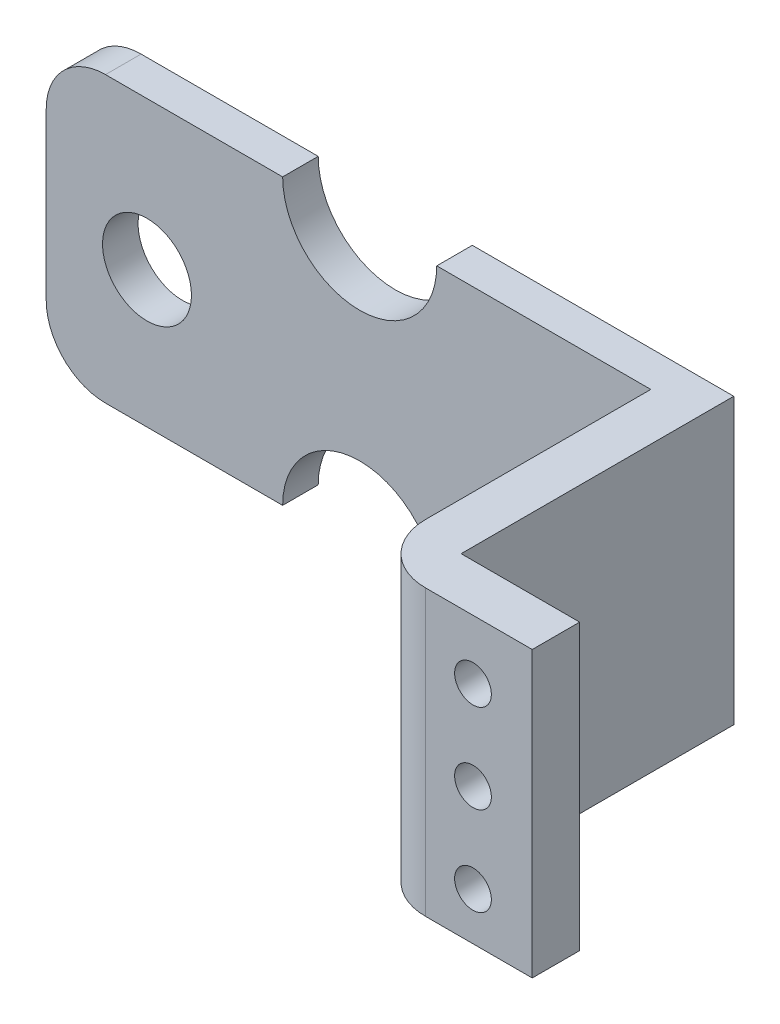
ISO-10303-21;
HEADER;
FILE_DESCRIPTION(('STEP AP214'),'2;1');
FILE_NAME('part.step','',(''),(''),'','','');
FILE_SCHEMA(('AUTOMOTIVE_DESIGN { 1 0 10303 214 1 1 1 1 }'));
ENDSEC;
DATA;
#1=APPLICATION_CONTEXT('core data for automotive mechanical design processes');
#2=APPLICATION_PROTOCOL_DEFINITION('international standard','automotive_design',2000,#1);
#3=PRODUCT_CONTEXT('',#1,'mechanical');
#4=PRODUCT('Part','Part','',(#3));
#5=PRODUCT_RELATED_PRODUCT_CATEGORY('part','',(#4));
#6=PRODUCT_DEFINITION_FORMATION('','',#4);
#7=PRODUCT_DEFINITION_CONTEXT('part definition',#1,'design');
#8=PRODUCT_DEFINITION('design','',#6,#7);
#9=PRODUCT_DEFINITION_SHAPE('','',#8);
#10=(LENGTH_UNIT() NAMED_UNIT(*) SI_UNIT(.MILLI.,.METRE.));
#11=(NAMED_UNIT(*) PLANE_ANGLE_UNIT() SI_UNIT($,.RADIAN.));
#12=(NAMED_UNIT(*) SI_UNIT($,.STERADIAN.) SOLID_ANGLE_UNIT());
#13=UNCERTAINTY_MEASURE_WITH_UNIT(LENGTH_MEASURE(1.E-05),#10,'distance_accuracy_value','');
#14=(GEOMETRIC_REPRESENTATION_CONTEXT(3) GLOBAL_UNCERTAINTY_ASSIGNED_CONTEXT((#13)) GLOBAL_UNIT_ASSIGNED_CONTEXT((#10,
#11,#12)) REPRESENTATION_CONTEXT('',''));
#15=CARTESIAN_POINT('',(0.,0.,0.));
#16=DIRECTION('',(0.,0.,1.));
#17=DIRECTION('',(1.,0.,0.));
#18=AXIS2_PLACEMENT_3D('',#15,#16,#17);
#19=CARTESIAN_POINT('',(27.5,-12.,3.));
#20=DIRECTION('',(0.,1.,0.));
#21=DIRECTION('',(-1.,0.,0.));
#22=AXIS2_PLACEMENT_3D('',#19,#20,#21);
#23=PLANE('',#22);
#24=DIRECTION('',(1.,0.,0.));
#25=VECTOR('',#24,1.);
#26=CARTESIAN_POINT('',(27.5,-12.,3.));
#27=LINE('',#26,#25);
#28=CARTESIAN_POINT('',(-22.5,-12.,3.));
#29=VERTEX_POINT('',#28);
#30=CARTESIAN_POINT('',(-7.55662202552214,-12.,3.));
#31=VERTEX_POINT('',#30);
#32=EDGE_CURVE('E173',#29,#31,#27,.T.);
#33=ORIENTED_EDGE('',*,*,#32,.F.);
#34=DIRECTION('',(0.,0.,-1.));
#35=VECTOR('',#34,1.);
#36=CARTESIAN_POINT('',(-22.5,-12.,3.));
#37=LINE('',#36,#35);
#38=CARTESIAN_POINT('',(-22.5,-12.,0.));
#39=VERTEX_POINT('',#38);
#40=EDGE_CURVE('E211',#29,#39,#37,.T.);
#41=ORIENTED_EDGE('',*,*,#40,.T.);
#42=DIRECTION('',(1.,0.,0.));
#43=VECTOR('',#42,1.);
#44=CARTESIAN_POINT('',(27.5,-12.,0.));
#45=LINE('',#44,#43);
#46=CARTESIAN_POINT('',(-7.55662202552214,-12.,0.));
#47=VERTEX_POINT('',#46);
#48=EDGE_CURVE('E181',#39,#47,#45,.T.);
#49=ORIENTED_EDGE('',*,*,#48,.T.);
#50=DIRECTION('',(0.,0.,1.));
#51=VECTOR('',#50,1.);
#52=CARTESIAN_POINT('',(-7.55662202552214,-12.,-0.00100000000000013));
#53=LINE('',#52,#51);
#54=EDGE_CURVE('E233',#31,#47,#53,.F.);
#55=ORIENTED_EDGE('',*,*,#54,.F.);
#56=EDGE_LOOP('',(#33,#41,#49,#55));
#57=FACE_BOUND('',#56,.T.);
#58=ADVANCED_FACE('F34',(#57),#23,.F.);
#59=CARTESIAN_POINT('',(27.5,12.,3.));
#60=DIRECTION('',(0.,-1.,0.));
#61=DIRECTION('',(1.,0.,0.));
#62=AXIS2_PLACEMENT_3D('',#59,#60,#61);
#63=PLANE('',#62);
#64=DIRECTION('',(0.,0.,-1.));
#65=VECTOR('',#64,1.);
#66=CARTESIAN_POINT('',(23.5,12.,27.));
#67=LINE('',#66,#65);
#68=CARTESIAN_POINT('',(23.5,12.,22.));
#69=VERTEX_POINT('',#68);
#70=CARTESIAN_POINT('',(23.5,12.,3.));
#71=VERTEX_POINT('',#70);
#72=EDGE_CURVE('E291',#69,#71,#67,.T.);
#73=ORIENTED_EDGE('',*,*,#72,.F.);
#74=CARTESIAN_POINT('',(28.5,12.,22.));
#75=DIRECTION('',(0.,-1.,0.));
#76=DIRECTION('',(1.,0.,0.));
#77=AXIS2_PLACEMENT_3D('',#74,#75,#76);
#78=CIRCLE('',#77,5.);
#79=CARTESIAN_POINT('',(28.5,12.,27.));
#80=VERTEX_POINT('',#79);
#81=EDGE_CURVE('E209',#69,#80,#78,.F.);
#82=ORIENTED_EDGE('',*,*,#81,.T.);
#83=DIRECTION('',(-1.,0.,0.));
#84=VECTOR('',#83,1.);
#85=CARTESIAN_POINT('',(27.5,12.,27.));
#86=LINE('',#85,#84);
#87=CARTESIAN_POINT('',(37.5,12.,27.));
#88=VERTEX_POINT('',#87);
#89=EDGE_CURVE('E283',#88,#80,#86,.T.);
#90=ORIENTED_EDGE('',*,*,#89,.F.);
#91=DIRECTION('',(0.,0.,1.));
#92=VECTOR('',#91,1.);
#93=CARTESIAN_POINT('',(37.5,12.,27.));
#94=LINE('',#93,#92);
#95=CARTESIAN_POINT('',(37.5,12.,23.));
#96=VERTEX_POINT('',#95);
#97=EDGE_CURVE('E272',#96,#88,#94,.T.);
#98=ORIENTED_EDGE('',*,*,#97,.F.);
#99=DIRECTION('',(-1.,0.,0.));
#100=VECTOR('',#99,1.);
#101=CARTESIAN_POINT('',(37.5,12.,23.));
#102=LINE('',#101,#100);
#103=CARTESIAN_POINT('',(27.5,12.,23.));
#104=VERTEX_POINT('',#103);
#105=EDGE_CURVE('E275',#96,#104,#102,.T.);
#106=ORIENTED_EDGE('',*,*,#105,.T.);
#107=DIRECTION('',(0.,0.,-1.));
#108=VECTOR('',#107,1.);
#109=CARTESIAN_POINT('',(27.5,12.,3.));
#110=LINE('',#109,#108);
#111=CARTESIAN_POINT('',(27.5,12.,0.));
#112=VERTEX_POINT('',#111);
#113=EDGE_CURVE('E168',#104,#112,#110,.T.);
#114=ORIENTED_EDGE('',*,*,#113,.T.);
#115=DIRECTION('',(-1.,0.,0.));
#116=VECTOR('',#115,1.);
#117=CARTESIAN_POINT('',(27.5,12.,0.));
#118=LINE('',#117,#116);
#119=CARTESIAN_POINT('',(5.44337797447786,12.,0.));
#120=VERTEX_POINT('',#119);
#121=EDGE_CURVE('E160',#112,#120,#118,.T.);
#122=ORIENTED_EDGE('',*,*,#121,.T.);
#123=DIRECTION('',(0.,0.,1.));
#124=VECTOR('',#123,1.);
#125=CARTESIAN_POINT('',(5.44337797447786,12.,-0.00100000000000013));
#126=LINE('',#125,#124);
#127=CARTESIAN_POINT('',(5.44337797447786,12.,3.));
#128=VERTEX_POINT('',#127);
#129=EDGE_CURVE('E145',#128,#120,#126,.F.);
#130=ORIENTED_EDGE('',*,*,#129,.F.);
#131=DIRECTION('',(-1.,0.,0.));
#132=VECTOR('',#131,1.);
#133=CARTESIAN_POINT('',(27.5,12.,3.));
#134=LINE('',#133,#132);
#135=EDGE_CURVE('E158',#71,#128,#134,.T.);
#136=ORIENTED_EDGE('',*,*,#135,.F.);
#137=EDGE_LOOP('',(#73,#82,#90,#98,#106,#114,#122,#130,#136));
#138=FACE_BOUND('',#137,.T.);
#139=ADVANCED_FACE('F157',(#138),#63,.F.);
#140=CARTESIAN_POINT('',(27.5,-12.,3.));
#141=DIRECTION('',(-1.,0.,0.));
#142=DIRECTION('',(0.,0.,1.));
#143=AXIS2_PLACEMENT_3D('',#140,#141,#142);
#144=PLANE('',#143);
#145=DIRECTION('',(0.,1.,0.));
#146=VECTOR('',#145,1.);
#147=CARTESIAN_POINT('',(27.5,12.,23.));
#148=LINE('',#147,#146);
#149=CARTESIAN_POINT('',(27.5,-12.,23.));
#150=VERTEX_POINT('',#149);
#151=EDGE_CURVE('E202',#150,#104,#148,.T.);
#152=ORIENTED_EDGE('',*,*,#151,.F.);
#153=DIRECTION('',(0.,0.,-1.));
#154=VECTOR('',#153,1.);
#155=CARTESIAN_POINT('',(27.5,-12.,3.));
#156=LINE('',#155,#154);
#157=CARTESIAN_POINT('',(27.5,-12.,0.));
#158=VERTEX_POINT('',#157);
#159=EDGE_CURVE('E171',#150,#158,#156,.T.);
#160=ORIENTED_EDGE('',*,*,#159,.T.);
#161=DIRECTION('',(0.,1.,0.));
#162=VECTOR('',#161,1.);
#163=CARTESIAN_POINT('',(27.5,-12.,0.));
#164=LINE('',#163,#162);
#165=EDGE_CURVE('E183',#158,#112,#164,.T.);
#166=ORIENTED_EDGE('',*,*,#165,.T.);
#167=ORIENTED_EDGE('',*,*,#113,.F.);
#168=EDGE_LOOP('',(#152,#160,#166,#167));
#169=FACE_BOUND('',#168,.T.);
#170=ADVANCED_FACE('F330',(#169),#144,.F.);
#171=CARTESIAN_POINT('',(0.,0.,3.));
#172=DIRECTION('',(0.,0.,1.));
#173=DIRECTION('',(1.,0.,0.));
#174=AXIS2_PLACEMENT_3D('',#171,#172,#173);
#175=PLANE('',#174);
#176=DIRECTION('',(0.,-1.,0.));
#177=VECTOR('',#176,1.);
#178=CARTESIAN_POINT('',(-27.5,-12.,3.));
#179=LINE('',#178,#177);
#180=CARTESIAN_POINT('',(-27.5,7.,3.));
#181=VERTEX_POINT('',#180);
#182=CARTESIAN_POINT('',(-27.5,-7.,3.));
#183=VERTEX_POINT('',#182);
#184=EDGE_CURVE('E187',#181,#183,#179,.T.);
#185=ORIENTED_EDGE('',*,*,#184,.T.);
#186=CARTESIAN_POINT('',(-22.5,-7.,3.));
#187=DIRECTION('',(0.,0.,1.));
#188=DIRECTION('',(1.,0.,0.));
#189=AXIS2_PLACEMENT_3D('',#186,#187,#188);
#190=CIRCLE('',#189,5.);
#191=EDGE_CURVE('E42',#183,#29,#190,.T.);
#192=ORIENTED_EDGE('',*,*,#191,.T.);
#193=ORIENTED_EDGE('',*,*,#32,.T.);
#194=CARTESIAN_POINT('',(-1.05662202552214,-12.,3.));
#195=DIRECTION('',(0.,0.,1.));
#196=DIRECTION('',(-1.,0.,0.));
#197=AXIS2_PLACEMENT_3D('',#194,#195,#196);
#198=CIRCLE('',#197,6.5);
#199=CARTESIAN_POINT('',(5.44337797447786,-12.,3.));
#200=VERTEX_POINT('',#199);
#201=EDGE_CURVE('E249',#200,#31,#198,.T.);
#202=ORIENTED_EDGE('',*,*,#201,.F.);
#203=CARTESIAN_POINT('',(23.5,-12.,3.));
#204=VERTEX_POINT('',#203);
#205=EDGE_CURVE('E234',#200,#204,#27,.T.);
#206=ORIENTED_EDGE('',*,*,#205,.T.);
#207=DIRECTION('',(0.,-1.,0.));
#208=VECTOR('',#207,1.);
#209=CARTESIAN_POINT('',(23.5,12.,3.));
#210=LINE('',#209,#208);
#211=EDGE_CURVE('E167',#71,#204,#210,.T.);
#212=ORIENTED_EDGE('',*,*,#211,.F.);
#213=ORIENTED_EDGE('',*,*,#135,.T.);
#214=CARTESIAN_POINT('',(-1.05662202552214,12.,3.));
#215=DIRECTION('',(0.,0.,1.));
#216=DIRECTION('',(1.,0.,0.));
#217=AXIS2_PLACEMENT_3D('',#214,#215,#216);
#218=CIRCLE('',#217,6.5);
#219=CARTESIAN_POINT('',(-7.55662202552214,12.,3.));
#220=VERTEX_POINT('',#219);
#221=EDGE_CURVE('E142',#220,#128,#218,.T.);
#222=ORIENTED_EDGE('',*,*,#221,.F.);
#223=CARTESIAN_POINT('',(-22.5,12.,3.));
#224=VERTEX_POINT('',#223);
#225=EDGE_CURVE('E169',#220,#224,#134,.T.);
#226=ORIENTED_EDGE('',*,*,#225,.T.);
#227=CARTESIAN_POINT('',(-22.5,7.,3.));
#228=DIRECTION('',(0.,0.,1.));
#229=DIRECTION('',(1.,0.,0.));
#230=AXIS2_PLACEMENT_3D('',#227,#228,#229);
#231=CIRCLE('',#230,5.);
#232=EDGE_CURVE('E222',#224,#181,#231,.T.);
#233=ORIENTED_EDGE('',*,*,#232,.T.);
#234=EDGE_LOOP('',(#185,#192,#193,#202,#206,#212,#213,#222,#226,#233));
#235=FACE_BOUND('',#234,.T.);
#236=CARTESIAN_POINT('',(-19.,-0.500000000000002,3.));
#237=DIRECTION('',(0.,0.,1.));
#238=DIRECTION('',(1.,0.,0.));
#239=AXIS2_PLACEMENT_3D('',#236,#237,#238);
#240=CIRCLE('',#239,3.75);
#241=CARTESIAN_POINT('',(-15.25,-0.500000000000002,3.));
#242=VERTEX_POINT('',#241);
#243=EDGE_CURVE('E180',#242,#242,#240,.T.);
#244=ORIENTED_EDGE('',*,*,#243,.F.);
#245=EDGE_LOOP('',(#244));
#246=FACE_BOUND('',#245,.T.);
#247=CARTESIAN_POINT('',(17.,-0.500000000000002,3.));
#248=DIRECTION('',(0.,0.,1.));
#249=DIRECTION('',(1.,0.,0.));
#250=AXIS2_PLACEMENT_3D('',#247,#248,#249);
#251=CIRCLE('',#250,3.75);
#252=CARTESIAN_POINT('',(20.75,-0.500000000000002,3.));
#253=VERTEX_POINT('',#252);
#254=EDGE_CURVE('E294',#253,#253,#251,.T.);
#255=ORIENTED_EDGE('',*,*,#254,.F.);
#256=EDGE_LOOP('',(#255));
#257=FACE_BOUND('',#256,.T.);
#258=ADVANCED_FACE('F163',(#235,#246,#257),#175,.T.);
#259=CARTESIAN_POINT('',(0.,0.,0.));
#260=DIRECTION('',(0.,0.,1.));
#261=DIRECTION('',(1.,0.,0.));
#262=AXIS2_PLACEMENT_3D('',#259,#260,#261);
#263=PLANE('',#262);
#264=ORIENTED_EDGE('',*,*,#48,.F.);
#265=CARTESIAN_POINT('',(-22.5,-7.,0.));
#266=DIRECTION('',(0.,0.,1.));
#267=DIRECTION('',(1.,0.,0.));
#268=AXIS2_PLACEMENT_3D('',#265,#266,#267);
#269=CIRCLE('',#268,5.);
#270=CARTESIAN_POINT('',(-27.5,-7.,0.));
#271=VERTEX_POINT('',#270);
#272=EDGE_CURVE('E216',#39,#271,#269,.F.);
#273=ORIENTED_EDGE('',*,*,#272,.T.);
#274=DIRECTION('',(0.,-1.,0.));
#275=VECTOR('',#274,1.);
#276=CARTESIAN_POINT('',(-27.5,-12.,0.));
#277=LINE('',#276,#275);
#278=CARTESIAN_POINT('',(-27.5,7.,0.));
#279=VERTEX_POINT('',#278);
#280=EDGE_CURVE('E177',#279,#271,#277,.T.);
#281=ORIENTED_EDGE('',*,*,#280,.F.);
#282=CARTESIAN_POINT('',(-22.5,7.,0.));
#283=DIRECTION('',(0.,0.,1.));
#284=DIRECTION('',(1.,0.,0.));
#285=AXIS2_PLACEMENT_3D('',#282,#283,#284);
#286=CIRCLE('',#285,5.);
#287=CARTESIAN_POINT('',(-22.5,12.,0.));
#288=VERTEX_POINT('',#287);
#289=EDGE_CURVE('E214',#279,#288,#286,.F.);
#290=ORIENTED_EDGE('',*,*,#289,.T.);
#291=CARTESIAN_POINT('',(-7.55662202552214,12.,0.));
#292=VERTEX_POINT('',#291);
#293=EDGE_CURVE('E186',#292,#288,#118,.T.);
#294=ORIENTED_EDGE('',*,*,#293,.F.);
#295=CARTESIAN_POINT('',(-1.05662202552214,12.,0.));
#296=DIRECTION('',(0.,0.,1.));
#297=DIRECTION('',(1.,0.,0.));
#298=AXIS2_PLACEMENT_3D('',#295,#296,#297);
#299=CIRCLE('',#298,6.5);
#300=EDGE_CURVE('E151',#120,#292,#299,.F.);
#301=ORIENTED_EDGE('',*,*,#300,.F.);
#302=ORIENTED_EDGE('',*,*,#121,.F.);
#303=ORIENTED_EDGE('',*,*,#165,.F.);
#304=CARTESIAN_POINT('',(5.44337797447786,-12.,0.));
#305=VERTEX_POINT('',#304);
#306=EDGE_CURVE('E179',#305,#158,#45,.T.);
#307=ORIENTED_EDGE('',*,*,#306,.F.);
#308=CARTESIAN_POINT('',(-1.05662202552214,-12.,0.));
#309=DIRECTION('',(0.,0.,1.));
#310=DIRECTION('',(1.,0.,0.));
#311=AXIS2_PLACEMENT_3D('',#308,#309,#310);
#312=CIRCLE('',#311,6.5);
#313=EDGE_CURVE('E247',#47,#305,#312,.F.);
#314=ORIENTED_EDGE('',*,*,#313,.F.);
#315=EDGE_LOOP('',(#264,#273,#281,#290,#294,#301,#302,#303,#307,#314));
#316=FACE_BOUND('',#315,.T.);
#317=CARTESIAN_POINT('',(-19.,-0.500000000000002,0.));
#318=DIRECTION('',(0.,0.,1.));
#319=DIRECTION('',(1.,0.,0.));
#320=AXIS2_PLACEMENT_3D('',#317,#318,#319);
#321=CIRCLE('',#320,3.75);
#322=CARTESIAN_POINT('',(-15.25,-0.500000000000002,0.));
#323=VERTEX_POINT('',#322);
#324=EDGE_CURVE('E297',#323,#323,#321,.T.);
#325=ORIENTED_EDGE('',*,*,#324,.T.);
#326=EDGE_LOOP('',(#325));
#327=FACE_BOUND('',#326,.T.);
#328=CARTESIAN_POINT('',(17.,-0.500000000000002,0.));
#329=DIRECTION('',(0.,0.,1.));
#330=DIRECTION('',(1.,0.,0.));
#331=AXIS2_PLACEMENT_3D('',#328,#329,#330);
#332=CIRCLE('',#331,3.75);
#333=CARTESIAN_POINT('',(20.75,-0.500000000000002,0.));
#334=VERTEX_POINT('',#333);
#335=EDGE_CURVE('E293',#334,#334,#332,.T.);
#336=ORIENTED_EDGE('',*,*,#335,.T.);
#337=EDGE_LOOP('',(#336));
#338=FACE_BOUND('',#337,.T.);
#339=ADVANCED_FACE('F238',(#316,#327,#338),#263,.F.);
#340=CARTESIAN_POINT('',(-27.5,-12.,3.));
#341=DIRECTION('',(1.,0.,0.));
#342=DIRECTION('',(0.,0.,-1.));
#343=AXIS2_PLACEMENT_3D('',#340,#341,#342);
#344=PLANE('',#343);
#345=ORIENTED_EDGE('',*,*,#280,.T.);
#346=DIRECTION('',(0.,0.,-1.));
#347=VECTOR('',#346,1.);
#348=CARTESIAN_POINT('',(-27.5,-7.,3.));
#349=LINE('',#348,#347);
#350=EDGE_CURVE('E55',#271,#183,#349,.F.);
#351=ORIENTED_EDGE('',*,*,#350,.T.);
#352=ORIENTED_EDGE('',*,*,#184,.F.);
#353=DIRECTION('',(0.,0.,-1.));
#354=VECTOR('',#353,1.);
#355=CARTESIAN_POINT('',(-27.5,7.,3.));
#356=LINE('',#355,#354);
#357=EDGE_CURVE('E218',#181,#279,#356,.T.);
#358=ORIENTED_EDGE('',*,*,#357,.T.);
#359=EDGE_LOOP('',(#345,#351,#352,#358));
#360=FACE_BOUND('',#359,.T.);
#361=ADVANCED_FACE('F241',(#360),#344,.F.);
#362=DIRECTION('',(1.,0.,0.));
#363=VECTOR('',#362,1.);
#364=CARTESIAN_POINT('',(27.5,-12.,27.));
#365=LINE('',#364,#363);
#366=CARTESIAN_POINT('',(28.5,-12.,27.));
#367=VERTEX_POINT('',#366);
#368=CARTESIAN_POINT('',(37.5,-12.,27.));
#369=VERTEX_POINT('',#368);
#370=EDGE_CURVE('E286',#367,#369,#365,.T.);
#371=ORIENTED_EDGE('',*,*,#370,.F.);
#372=CARTESIAN_POINT('',(28.5,-12.,22.));
#373=DIRECTION('',(0.,1.,0.));
#374=DIRECTION('',(-1.,0.,0.));
#375=AXIS2_PLACEMENT_3D('',#372,#373,#374);
#376=CIRCLE('',#375,5.);
#377=CARTESIAN_POINT('',(23.5,-12.,22.));
#378=VERTEX_POINT('',#377);
#379=EDGE_CURVE('E205',#367,#378,#376,.F.);
#380=ORIENTED_EDGE('',*,*,#379,.T.);
#381=DIRECTION('',(0.,0.,-1.));
#382=VECTOR('',#381,1.);
#383=CARTESIAN_POINT('',(23.5,-12.,27.));
#384=LINE('',#383,#382);
#385=EDGE_CURVE('E288',#378,#204,#384,.T.);
#386=ORIENTED_EDGE('',*,*,#385,.T.);
#387=ORIENTED_EDGE('',*,*,#205,.F.);
#388=DIRECTION('',(0.,0.,1.));
#389=VECTOR('',#388,1.);
#390=CARTESIAN_POINT('',(5.44337797447786,-12.,-0.00100000000000013));
#391=LINE('',#390,#389);
#392=EDGE_CURVE('E254',#305,#200,#391,.T.);
#393=ORIENTED_EDGE('',*,*,#392,.F.);
#394=ORIENTED_EDGE('',*,*,#306,.T.);
#395=ORIENTED_EDGE('',*,*,#159,.F.);
#396=DIRECTION('',(-1.,0.,0.));
#397=VECTOR('',#396,1.);
#398=CARTESIAN_POINT('',(37.5,-12.,23.));
#399=LINE('',#398,#397);
#400=CARTESIAN_POINT('',(37.5,-12.,23.));
#401=VERTEX_POINT('',#400);
#402=EDGE_CURVE('E280',#401,#150,#399,.T.);
#403=ORIENTED_EDGE('',*,*,#402,.F.);
#404=DIRECTION('',(0.,0.,-1.));
#405=VECTOR('',#404,1.);
#406=CARTESIAN_POINT('',(37.5,-12.,27.));
#407=LINE('',#406,#405);
#408=EDGE_CURVE('E268',#369,#401,#407,.T.);
#409=ORIENTED_EDGE('',*,*,#408,.F.);
#410=EDGE_LOOP('',(#371,#380,#386,#387,#393,#394,#395,#403,#409));
#411=FACE_BOUND('',#410,.T.);
#412=ADVANCED_FACE('F319',(#411),#23,.F.);
#413=ORIENTED_EDGE('',*,*,#293,.T.);
#414=DIRECTION('',(0.,0.,-1.));
#415=VECTOR('',#414,1.);
#416=CARTESIAN_POINT('',(-22.5,12.,3.));
#417=LINE('',#416,#415);
#418=EDGE_CURVE('E11',#288,#224,#417,.F.);
#419=ORIENTED_EDGE('',*,*,#418,.T.);
#420=ORIENTED_EDGE('',*,*,#225,.F.);
#421=DIRECTION('',(0.,0.,1.));
#422=VECTOR('',#421,1.);
#423=CARTESIAN_POINT('',(-7.55662202552214,12.,-0.00100000000000013));
#424=LINE('',#423,#422);
#425=EDGE_CURVE('E148',#292,#220,#424,.T.);
#426=ORIENTED_EDGE('',*,*,#425,.F.);
#427=EDGE_LOOP('',(#413,#419,#420,#426));
#428=FACE_BOUND('',#427,.T.);
#429=ADVANCED_FACE('F246',(#428),#63,.F.);
#430=CARTESIAN_POINT('',(-19.,-0.500000000000002,3.));
#431=DIRECTION('',(0.,0.,-1.));
#432=DIRECTION('',(-1.,0.,0.));
#433=AXIS2_PLACEMENT_3D('',#430,#431,#432);
#434=CYLINDRICAL_SURFACE('',#433,3.75);
#435=ORIENTED_EDGE('',*,*,#243,.T.);
#436=EDGE_LOOP('',(#435));
#437=FACE_BOUND('',#436,.T.);
#438=ORIENTED_EDGE('',*,*,#324,.F.);
#439=EDGE_LOOP('',(#438));
#440=FACE_BOUND('',#439,.T.);
#441=ADVANCED_FACE('F358',(#437,#440),#434,.F.);
#442=CARTESIAN_POINT('',(17.,-0.500000000000002,3.));
#443=DIRECTION('',(0.,0.,-1.));
#444=DIRECTION('',(-1.,0.,0.));
#445=AXIS2_PLACEMENT_3D('',#442,#443,#444);
#446=CYLINDRICAL_SURFACE('',#445,3.75);
#447=ORIENTED_EDGE('',*,*,#254,.T.);
#448=EDGE_LOOP('',(#447));
#449=FACE_BOUND('',#448,.T.);
#450=ORIENTED_EDGE('',*,*,#335,.F.);
#451=EDGE_LOOP('',(#450));
#452=FACE_BOUND('',#451,.T.);
#453=ADVANCED_FACE('F402',(#449,#452),#446,.F.);
#454=CARTESIAN_POINT('',(23.5,12.,27.));
#455=DIRECTION('',(1.,0.,0.));
#456=DIRECTION('',(0.,1.,0.));
#457=AXIS2_PLACEMENT_3D('',#454,#455,#456);
#458=PLANE('',#457);
#459=ORIENTED_EDGE('',*,*,#385,.F.);
#460=DIRECTION('',(0.,-1.,0.));
#461=VECTOR('',#460,1.);
#462=CARTESIAN_POINT('',(23.5,12.,22.));
#463=LINE('',#462,#461);
#464=EDGE_CURVE('E207',#378,#69,#463,.F.);
#465=ORIENTED_EDGE('',*,*,#464,.T.);
#466=ORIENTED_EDGE('',*,*,#72,.T.);
#467=ORIENTED_EDGE('',*,*,#211,.T.);
#468=EDGE_LOOP('',(#459,#465,#466,#467));
#469=FACE_BOUND('',#468,.T.);
#470=ADVANCED_FACE('F308',(#469),#458,.F.);
#471=CARTESIAN_POINT('',(0.,0.,27.));
#472=DIRECTION('',(0.,0.,-1.));
#473=DIRECTION('',(-1.,0.,0.));
#474=AXIS2_PLACEMENT_3D('',#471,#472,#473);
#475=PLANE('',#474);
#476=CARTESIAN_POINT('',(32.5,7.,27.));
#477=DIRECTION('',(0.,0.,1.));
#478=DIRECTION('',(1.,0.,0.));
#479=AXIS2_PLACEMENT_3D('',#476,#477,#478);
#480=CIRCLE('',#479,1.55);
#481=CARTESIAN_POINT('',(34.05,7.,27.));
#482=VERTEX_POINT('',#481);
#483=EDGE_CURVE('E196',#482,#482,#480,.T.);
#484=ORIENTED_EDGE('',*,*,#483,.F.);
#485=EDGE_LOOP('',(#484));
#486=FACE_BOUND('',#485,.T.);
#487=CARTESIAN_POINT('',(32.5,-0.499999999999996,27.));
#488=DIRECTION('',(0.,0.,1.));
#489=DIRECTION('',(1.,0.,0.));
#490=AXIS2_PLACEMENT_3D('',#487,#488,#489);
#491=CIRCLE('',#490,1.55);
#492=CARTESIAN_POINT('',(34.05,-0.499999999999996,27.));
#493=VERTEX_POINT('',#492);
#494=EDGE_CURVE('E260',#493,#493,#491,.T.);
#495=ORIENTED_EDGE('',*,*,#494,.F.);
#496=EDGE_LOOP('',(#495));
#497=FACE_BOUND('',#496,.T.);
#498=CARTESIAN_POINT('',(32.5,-8.,27.));
#499=DIRECTION('',(0.,0.,1.));
#500=DIRECTION('',(1.,0.,0.));
#501=AXIS2_PLACEMENT_3D('',#498,#499,#500);
#502=CIRCLE('',#501,1.55);
#503=CARTESIAN_POINT('',(34.05,-8.,27.));
#504=VERTEX_POINT('',#503);
#505=EDGE_CURVE('E253',#504,#504,#502,.T.);
#506=ORIENTED_EDGE('',*,*,#505,.F.);
#507=EDGE_LOOP('',(#506));
#508=FACE_BOUND('',#507,.T.);
#509=ORIENTED_EDGE('',*,*,#89,.T.);
#510=DIRECTION('',(0.,-1.,0.));
#511=VECTOR('',#510,1.);
#512=CARTESIAN_POINT('',(28.5,0.,27.));
#513=LINE('',#512,#511);
#514=EDGE_CURVE('E191',#80,#367,#513,.T.);
#515=ORIENTED_EDGE('',*,*,#514,.T.);
#516=ORIENTED_EDGE('',*,*,#370,.T.);
#517=DIRECTION('',(0.,-1.,0.));
#518=VECTOR('',#517,1.);
#519=CARTESIAN_POINT('',(37.5,12.,27.));
#520=LINE('',#519,#518);
#521=EDGE_CURVE('E265',#88,#369,#520,.T.);
#522=ORIENTED_EDGE('',*,*,#521,.F.);
#523=EDGE_LOOP('',(#509,#515,#516,#522));
#524=FACE_BOUND('',#523,.T.);
#525=ADVANCED_FACE('F316',(#486,#497,#508,#524),#475,.F.);
#526=CARTESIAN_POINT('',(37.5,12.,23.));
#527=DIRECTION('',(0.,0.,1.));
#528=DIRECTION('',(0.,-1.,0.));
#529=AXIS2_PLACEMENT_3D('',#526,#527,#528);
#530=PLANE('',#529);
#531=CARTESIAN_POINT('',(32.5,7.,23.));
#532=DIRECTION('',(0.,0.,1.));
#533=DIRECTION('',(0.,-1.,0.));
#534=AXIS2_PLACEMENT_3D('',#531,#532,#533);
#535=CIRCLE('',#534,1.55);
#536=CARTESIAN_POINT('',(32.5,5.45,23.));
#537=VERTEX_POINT('',#536);
#538=EDGE_CURVE('E199',#537,#537,#535,.T.);
#539=ORIENTED_EDGE('',*,*,#538,.T.);
#540=EDGE_LOOP('',(#539));
#541=FACE_BOUND('',#540,.T.);
#542=CARTESIAN_POINT('',(32.5,-0.499999999999996,23.));
#543=DIRECTION('',(0.,0.,1.));
#544=DIRECTION('',(0.,-1.,0.));
#545=AXIS2_PLACEMENT_3D('',#542,#543,#544);
#546=CIRCLE('',#545,1.55);
#547=CARTESIAN_POINT('',(32.5,-2.05,23.));
#548=VERTEX_POINT('',#547);
#549=EDGE_CURVE('E195',#548,#548,#546,.T.);
#550=ORIENTED_EDGE('',*,*,#549,.T.);
#551=EDGE_LOOP('',(#550));
#552=FACE_BOUND('',#551,.T.);
#553=CARTESIAN_POINT('',(32.5,-8.,23.));
#554=DIRECTION('',(0.,0.,1.));
#555=DIRECTION('',(0.,-1.,0.));
#556=AXIS2_PLACEMENT_3D('',#553,#554,#555);
#557=CIRCLE('',#556,1.55);
#558=CARTESIAN_POINT('',(32.5,-9.55,23.));
#559=VERTEX_POINT('',#558);
#560=EDGE_CURVE('E192',#559,#559,#557,.T.);
#561=ORIENTED_EDGE('',*,*,#560,.T.);
#562=EDGE_LOOP('',(#561));
#563=FACE_BOUND('',#562,.T.);
#564=ORIENTED_EDGE('',*,*,#151,.T.);
#565=ORIENTED_EDGE('',*,*,#105,.F.);
#566=DIRECTION('',(0.,1.,0.));
#567=VECTOR('',#566,1.);
#568=CARTESIAN_POINT('',(37.5,12.,23.));
#569=LINE('',#568,#567);
#570=EDGE_CURVE('E270',#401,#96,#569,.T.);
#571=ORIENTED_EDGE('',*,*,#570,.F.);
#572=ORIENTED_EDGE('',*,*,#402,.T.);
#573=EDGE_LOOP('',(#564,#565,#571,#572));
#574=FACE_BOUND('',#573,.T.);
#575=ADVANCED_FACE('F328',(#541,#552,#563,#574),#530,.F.);
#576=CARTESIAN_POINT('',(37.5,0.,0.));
#577=DIRECTION('',(1.,0.,0.));
#578=DIRECTION('',(0.,0.,-1.));
#579=AXIS2_PLACEMENT_3D('',#576,#577,#578);
#580=PLANE('',#579);
#581=ORIENTED_EDGE('',*,*,#521,.T.);
#582=ORIENTED_EDGE('',*,*,#408,.T.);
#583=ORIENTED_EDGE('',*,*,#570,.T.);
#584=ORIENTED_EDGE('',*,*,#97,.T.);
#585=EDGE_LOOP('',(#581,#582,#583,#584));
#586=FACE_BOUND('',#585,.T.);
#587=ADVANCED_FACE('F324',(#586),#580,.T.);
#588=CARTESIAN_POINT('',(32.5,-8.,17.));
#589=DIRECTION('',(0.,0.,1.));
#590=DIRECTION('',(1.,0.,0.));
#591=AXIS2_PLACEMENT_3D('',#588,#589,#590);
#592=CYLINDRICAL_SURFACE('',#591,1.55);
#593=ORIENTED_EDGE('',*,*,#505,.T.);
#594=EDGE_LOOP('',(#593));
#595=FACE_BOUND('',#594,.T.);
#596=ORIENTED_EDGE('',*,*,#560,.F.);
#597=EDGE_LOOP('',(#596));
#598=FACE_BOUND('',#597,.T.);
#599=ADVANCED_FACE('F477',(#595,#598),#592,.F.);
#600=CARTESIAN_POINT('',(32.5,-0.499999999999996,17.));
#601=DIRECTION('',(0.,0.,1.));
#602=DIRECTION('',(1.,0.,0.));
#603=AXIS2_PLACEMENT_3D('',#600,#601,#602);
#604=CYLINDRICAL_SURFACE('',#603,1.55);
#605=ORIENTED_EDGE('',*,*,#494,.T.);
#606=EDGE_LOOP('',(#605));
#607=FACE_BOUND('',#606,.T.);
#608=ORIENTED_EDGE('',*,*,#549,.F.);
#609=EDGE_LOOP('',(#608));
#610=FACE_BOUND('',#609,.T.);
#611=ADVANCED_FACE('F467',(#607,#610),#604,.F.);
#612=CARTESIAN_POINT('',(32.5,7.,17.));
#613=DIRECTION('',(0.,0.,1.));
#614=DIRECTION('',(1.,0.,0.));
#615=AXIS2_PLACEMENT_3D('',#612,#613,#614);
#616=CYLINDRICAL_SURFACE('',#615,1.55);
#617=ORIENTED_EDGE('',*,*,#483,.T.);
#618=EDGE_LOOP('',(#617));
#619=FACE_BOUND('',#618,.T.);
#620=ORIENTED_EDGE('',*,*,#538,.F.);
#621=EDGE_LOOP('',(#620));
#622=FACE_BOUND('',#621,.T.);
#623=ADVANCED_FACE('F342',(#619,#622),#616,.F.);
#624=CARTESIAN_POINT('',(-1.05662202552214,12.,-0.00100000000000013));
#625=DIRECTION('',(0.,0.,1.));
#626=DIRECTION('',(1.,0.,0.));
#627=AXIS2_PLACEMENT_3D('',#624,#625,#626);
#628=CYLINDRICAL_SURFACE('',#627,6.5);
#629=ORIENTED_EDGE('',*,*,#129,.T.);
#630=ORIENTED_EDGE('',*,*,#300,.T.);
#631=ORIENTED_EDGE('',*,*,#425,.T.);
#632=ORIENTED_EDGE('',*,*,#221,.T.);
#633=EDGE_LOOP('',(#629,#630,#631,#632));
#634=FACE_BOUND('',#633,.T.);
#635=ADVANCED_FACE('F144',(#634),#628,.F.);
#636=CARTESIAN_POINT('',(-1.05662202552214,-12.,-0.00100000000000013));
#637=DIRECTION('',(0.,0.,1.));
#638=DIRECTION('',(1.,0.,0.));
#639=AXIS2_PLACEMENT_3D('',#636,#637,#638);
#640=CYLINDRICAL_SURFACE('',#639,6.5);
#641=ORIENTED_EDGE('',*,*,#54,.T.);
#642=ORIENTED_EDGE('',*,*,#313,.T.);
#643=ORIENTED_EDGE('',*,*,#392,.T.);
#644=ORIENTED_EDGE('',*,*,#201,.T.);
#645=EDGE_LOOP('',(#641,#642,#643,#644));
#646=FACE_BOUND('',#645,.T.);
#647=ADVANCED_FACE('F334',(#646),#640,.F.);
#648=CARTESIAN_POINT('',(28.5,0.,22.));
#649=DIRECTION('',(0.,-1.,0.));
#650=DIRECTION('',(1.,0.,0.));
#651=AXIS2_PLACEMENT_3D('',#648,#649,#650);
#652=CYLINDRICAL_SURFACE('',#651,5.);
#653=ORIENTED_EDGE('',*,*,#81,.F.);
#654=ORIENTED_EDGE('',*,*,#464,.F.);
#655=ORIENTED_EDGE('',*,*,#379,.F.);
#656=ORIENTED_EDGE('',*,*,#514,.F.);
#657=EDGE_LOOP('',(#653,#654,#655,#656));
#658=FACE_BOUND('',#657,.T.);
#659=ADVANCED_FACE('F313',(#658),#652,.T.);
#660=CARTESIAN_POINT('',(-22.5,-7.,3.));
#661=DIRECTION('',(0.,0.,-1.));
#662=DIRECTION('',(-1.,0.,0.));
#663=AXIS2_PLACEMENT_3D('',#660,#661,#662);
#664=CYLINDRICAL_SURFACE('',#663,5.);
#665=ORIENTED_EDGE('',*,*,#191,.F.);
#666=ORIENTED_EDGE('',*,*,#350,.F.);
#667=ORIENTED_EDGE('',*,*,#272,.F.);
#668=ORIENTED_EDGE('',*,*,#40,.F.);
#669=EDGE_LOOP('',(#665,#666,#667,#668));
#670=FACE_BOUND('',#669,.T.);
#671=ADVANCED_FACE('F235',(#670),#664,.T.);
#672=CARTESIAN_POINT('',(-22.5,7.,3.));
#673=DIRECTION('',(0.,0.,-1.));
#674=DIRECTION('',(-1.,0.,0.));
#675=AXIS2_PLACEMENT_3D('',#672,#673,#674);
#676=CYLINDRICAL_SURFACE('',#675,5.);
#677=ORIENTED_EDGE('',*,*,#232,.F.);
#678=ORIENTED_EDGE('',*,*,#418,.F.);
#679=ORIENTED_EDGE('',*,*,#289,.F.);
#680=ORIENTED_EDGE('',*,*,#357,.F.);
#681=EDGE_LOOP('',(#677,#678,#679,#680));
#682=FACE_BOUND('',#681,.T.);
#683=ADVANCED_FACE('F36',(#682),#676,.T.);
#684=CLOSED_SHELL('',(#58,#139,#170,#258,#339,#361,#412,#429,#441,#453,#470,#525,#575,#587,#599,
#611,#623,#635,#647,#659,#671,#683));
#685=MANIFOLD_SOLID_BREP('B2',#684);
#686=ADVANCED_BREP_SHAPE_REPRESENTATION('',(#18,#685),#14);
#687=SHAPE_DEFINITION_REPRESENTATION(#9,#686);
ENDSEC;
END-ISO-10303-21;
